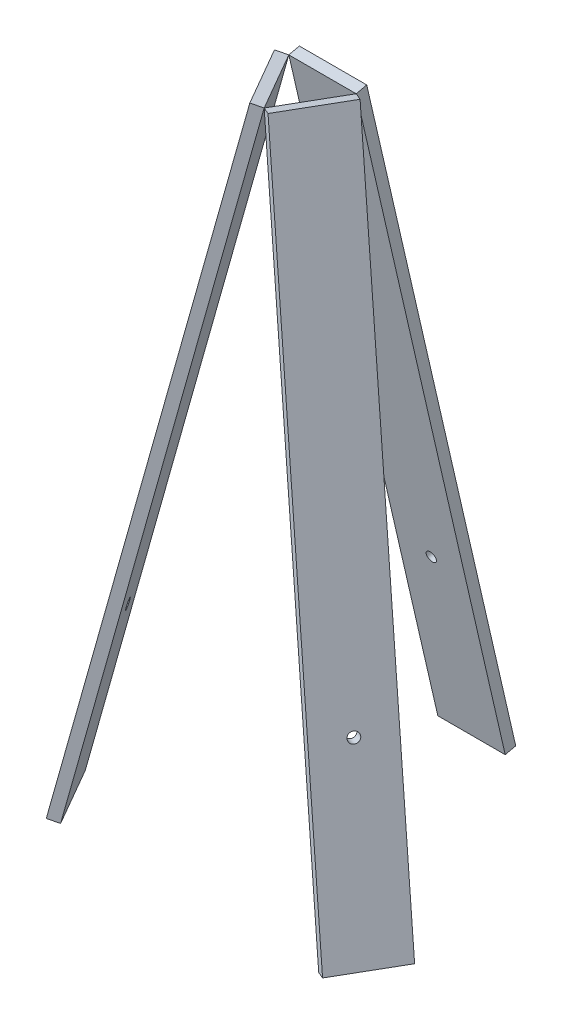
ISO-10303-21;
HEADER;
FILE_DESCRIPTION(('STEP AP214'),'2;1');
FILE_NAME('part.step','',(''),(''),'','','');
FILE_SCHEMA(('AUTOMOTIVE_DESIGN { 1 0 10303 214 1 1 1 1 }'));
ENDSEC;
DATA;
#1=APPLICATION_CONTEXT('core data for automotive mechanical design processes');
#2=APPLICATION_PROTOCOL_DEFINITION('international standard','automotive_design',2000,#1);
#3=PRODUCT_CONTEXT('',#1,'mechanical');
#4=PRODUCT('Part','Part','',(#3));
#5=PRODUCT_RELATED_PRODUCT_CATEGORY('part','',(#4));
#6=PRODUCT_DEFINITION_FORMATION('','',#4);
#7=PRODUCT_DEFINITION_CONTEXT('part definition',#1,'design');
#8=PRODUCT_DEFINITION('design','',#6,#7);
#9=PRODUCT_DEFINITION_SHAPE('','',#8);
#10=(LENGTH_UNIT() NAMED_UNIT(*) SI_UNIT(.MILLI.,.METRE.));
#11=(NAMED_UNIT(*) PLANE_ANGLE_UNIT() SI_UNIT($,.RADIAN.));
#12=(NAMED_UNIT(*) SI_UNIT($,.STERADIAN.) SOLID_ANGLE_UNIT());
#13=UNCERTAINTY_MEASURE_WITH_UNIT(LENGTH_MEASURE(1.E-05),#10,'distance_accuracy_value','');
#14=(GEOMETRIC_REPRESENTATION_CONTEXT(3) GLOBAL_UNCERTAINTY_ASSIGNED_CONTEXT((#13)) GLOBAL_UNIT_ASSIGNED_CONTEXT((#10,
#11,#12)) REPRESENTATION_CONTEXT('',''));
#15=CARTESIAN_POINT('',(0.,0.,0.));
#16=DIRECTION('',(0.,0.,1.));
#17=DIRECTION('',(1.,0.,0.));
#18=AXIS2_PLACEMENT_3D('',#15,#16,#17);
#19=CARTESIAN_POINT('',(-25.50091614306,10.3591491615835,8.94945810788122));
#20=DIRECTION('',(-0.499999999999992,0.,-0.866025403784443));
#21=DIRECTION('',(-0.866025403784443,0.,0.499999999999992));
#22=AXIS2_PLACEMENT_3D('',#19,#20,#21);
#23=PLANE('',#22);
#24=DIRECTION('',(0.194395186049515,0.974481408504561,-0.112234112994853));
#25=VECTOR('',#24,1.);
#26=CARTESIAN_POINT('',(-24.150635094611,10.,8.16987298107758));
#27=LINE('',#26,#25);
#28=CARTESIAN_POINT('',(-24.150635094611,10.,8.16987298107758));
#29=VERTEX_POINT('',#28);
#30=CARTESIAN_POINT('',(-4.99999999999997,106.,-2.88675134594818));
#31=VERTEX_POINT('',#30);
#32=EDGE_CURVE('E115',#29,#31,#27,.T.);
#33=ORIENTED_EDGE('',*,*,#32,.F.);
#34=DIRECTION('',(0.843925655280595,-0.224468225989709,-0.487240704252273));
#35=VECTOR('',#34,1.);
#36=CARTESIAN_POINT('',(-25.50091614306,10.3591491615835,8.94945810788122));
#37=LINE('',#36,#35);
#38=CARTESIAN_POINT('',(-25.50091614306,10.3591491615835,8.94945810788122));
#39=VERTEX_POINT('',#38);
#40=EDGE_CURVE('E12',#39,#29,#37,.T.);
#41=ORIENTED_EDGE('',*,*,#40,.F.);
#42=DIRECTION('',(0.194395186049515,0.974481408504561,-0.112234112994853));
#43=VECTOR('',#42,1.);
#44=CARTESIAN_POINT('',(-25.50091614306,10.3591491615835,8.94945810788122));
#45=LINE('',#44,#43);
#46=CARTESIAN_POINT('',(-6.35028104844892,106.359149161584,-2.10716621914454));
#47=VERTEX_POINT('',#46);
#48=EDGE_CURVE('E108',#39,#47,#45,.T.);
#49=ORIENTED_EDGE('',*,*,#48,.T.);
#50=DIRECTION('',(0.843925655280595,-0.224468225989709,-0.487240704252273));
#51=VECTOR('',#50,1.);
#52=CARTESIAN_POINT('',(-6.35028104844892,106.359149161584,-2.10716621914454));
#53=LINE('',#52,#51);
#54=EDGE_CURVE('E53',#47,#31,#53,.T.);
#55=ORIENTED_EDGE('',*,*,#54,.T.);
#56=EDGE_LOOP('',(#33,#41,#49,#55));
#57=FACE_BOUND('',#56,.T.);
#58=ADVANCED_FACE('F50',(#57),#23,.T.);
#59=CARTESIAN_POINT('',(-20.5009161430601,10.3591491615835,17.6097121457257));
#60=DIRECTION('',(-0.194395186049515,-0.974481408504561,0.112234112994853));
#61=DIRECTION('',(-0.843925655280595,0.224468225989709,0.487240704252273));
#62=AXIS2_PLACEMENT_3D('',#59,#60,#61);
#63=PLANE('',#62);
#64=DIRECTION('',(-0.499999999999992,0.,-0.866025403784443));
#65=VECTOR('',#64,1.);
#66=CARTESIAN_POINT('',(-19.1506350946111,10.,16.830127018922));
#67=LINE('',#66,#65);
#68=CARTESIAN_POINT('',(-19.1506350946111,10.,16.830127018922));
#69=VERTEX_POINT('',#68);
#70=EDGE_CURVE('E110',#69,#29,#67,.T.);
#71=ORIENTED_EDGE('',*,*,#70,.F.);
#72=DIRECTION('',(0.843925655280595,-0.224468225989709,-0.487240704252273));
#73=VECTOR('',#72,1.);
#74=CARTESIAN_POINT('',(-20.5009161430601,10.3591491615835,17.6097121457257));
#75=LINE('',#74,#73);
#76=CARTESIAN_POINT('',(-20.5009161430601,10.3591491615835,17.6097121457257));
#77=VERTEX_POINT('',#76);
#78=EDGE_CURVE('E59',#77,#69,#75,.T.);
#79=ORIENTED_EDGE('',*,*,#78,.F.);
#80=DIRECTION('',(-0.499999999999992,0.,-0.866025403784443));
#81=VECTOR('',#80,1.);
#82=CARTESIAN_POINT('',(-20.5009161430601,10.3591491615835,17.6097121457257));
#83=LINE('',#82,#81);
#84=EDGE_CURVE('E105',#77,#39,#83,.T.);
#85=ORIENTED_EDGE('',*,*,#84,.T.);
#86=ORIENTED_EDGE('',*,*,#40,.T.);
#87=EDGE_LOOP('',(#71,#79,#85,#86));
#88=FACE_BOUND('',#87,.T.);
#89=ADVANCED_FACE('F126',(#88),#63,.T.);
#90=CARTESIAN_POINT('',(-1.350281048449,106.359149161584,6.55308781869989));
#91=DIRECTION('',(0.499999999999992,0.,0.866025403784443));
#92=DIRECTION('',(0.866025403784443,0.,-0.499999999999992));
#93=AXIS2_PLACEMENT_3D('',#90,#91,#92);
#94=PLANE('',#93);
#95=DIRECTION('',(-0.194395186049515,-0.974481408504561,0.112234112994853));
#96=VECTOR('',#95,1.);
#97=CARTESIAN_POINT('',(0.,106.,5.77350269189626));
#98=LINE('',#97,#96);
#99=CARTESIAN_POINT('',(0.,106.,5.77350269189626));
#100=VERTEX_POINT('',#99);
#101=EDGE_CURVE('E100',#100,#69,#98,.T.);
#102=ORIENTED_EDGE('',*,*,#101,.F.);
#103=DIRECTION('',(0.843925655280595,-0.224468225989709,-0.487240704252273));
#104=VECTOR('',#103,1.);
#105=CARTESIAN_POINT('',(-1.350281048449,106.359149161584,6.55308781869989));
#106=LINE('',#105,#104);
#107=CARTESIAN_POINT('',(-1.350281048449,106.359149161584,6.55308781869989));
#108=VERTEX_POINT('',#107);
#109=EDGE_CURVE('E95',#108,#100,#106,.T.);
#110=ORIENTED_EDGE('',*,*,#109,.F.);
#111=DIRECTION('',(-0.194395186049515,-0.974481408504561,0.112234112994853));
#112=VECTOR('',#111,1.);
#113=CARTESIAN_POINT('',(-1.350281048449,106.359149161584,6.55308781869989));
#114=LINE('',#113,#112);
#115=EDGE_CURVE('E98',#108,#77,#114,.T.);
#116=ORIENTED_EDGE('',*,*,#115,.T.);
#117=ORIENTED_EDGE('',*,*,#78,.T.);
#118=EDGE_LOOP('',(#102,#110,#116,#117));
#119=FACE_BOUND('',#118,.T.);
#120=ADVANCED_FACE('F97',(#119),#94,.T.);
#121=CARTESIAN_POINT('',(-6.35028104844892,106.359149161584,-2.10716621914454));
#122=DIRECTION('',(0.194395186049515,0.974481408504561,-0.112234112994853));
#123=DIRECTION('',(0.843925655280595,-0.224468225989709,-0.487240704252273));
#124=AXIS2_PLACEMENT_3D('',#121,#122,#123);
#125=PLANE('',#124);
#126=DIRECTION('',(0.499999999999992,0.,0.866025403784443));
#127=VECTOR('',#126,1.);
#128=CARTESIAN_POINT('',(-4.99999999999997,106.,-2.88675134594818));
#129=LINE('',#128,#127);
#130=EDGE_CURVE('E118',#31,#100,#129,.T.);
#131=ORIENTED_EDGE('',*,*,#130,.F.);
#132=ORIENTED_EDGE('',*,*,#54,.F.);
#133=DIRECTION('',(0.499999999999992,0.,0.866025403784443));
#134=VECTOR('',#133,1.);
#135=CARTESIAN_POINT('',(-6.35028104844892,106.359149161584,-2.10716621914454));
#136=LINE('',#135,#134);
#137=EDGE_CURVE('E104',#47,#108,#136,.T.);
#138=ORIENTED_EDGE('',*,*,#137,.T.);
#139=ORIENTED_EDGE('',*,*,#109,.T.);
#140=EDGE_LOOP('',(#131,#132,#138,#139));
#141=FACE_BOUND('',#140,.T.);
#142=ADVANCED_FACE('F107',(#141),#125,.T.);
#143=CARTESIAN_POINT('',(-23.8043725263036,6.3315118320475,13.7434608859512));
#144=DIRECTION('',(0.843925655280595,-0.224468225989709,-0.487240704252273));
#145=DIRECTION('',(-0.194395186049515,-0.974481408504561,0.112234112994853));
#146=AXIS2_PLACEMENT_3D('',#143,#144,#145);
#147=PLANE('',#146);
#148=CARTESIAN_POINT('',(-17.8321724115731,36.2694855954062,10.2954095420573));
#149=DIRECTION('',(0.843925655280595,-0.224468225989709,-0.487240704252273));
#150=DIRECTION('',(-0.194395186049515,-0.974481408504561,0.112234112994853));
#151=AXIS2_PLACEMENT_3D('',#148,#149,#150);
#152=CIRCLE('',#151,0.750000000000009);
#153=CARTESIAN_POINT('',(-17.9779688011103,35.5386245390278,10.3795851268035));
#154=VERTEX_POINT('',#153);
#155=EDGE_CURVE('E119',#154,#154,#152,.T.);
#156=ORIENTED_EDGE('',*,*,#155,.T.);
#157=EDGE_LOOP('',(#156));
#158=FACE_BOUND('',#157,.T.);
#159=ORIENTED_EDGE('',*,*,#48,.F.);
#160=ORIENTED_EDGE('',*,*,#84,.F.);
#161=ORIENTED_EDGE('',*,*,#115,.F.);
#162=ORIENTED_EDGE('',*,*,#137,.F.);
#163=EDGE_LOOP('',(#159,#160,#161,#162));
#164=FACE_BOUND('',#163,.T.);
#165=ADVANCED_FACE('F103',(#158,#164),#147,.F.);
#166=CARTESIAN_POINT('',(-22.4540914778546,5.97236267046396,12.9638757591476));
#167=DIRECTION('',(0.843925655280595,-0.224468225989709,-0.487240704252273));
#168=DIRECTION('',(-0.194395186049515,-0.974481408504561,0.112234112994853));
#169=AXIS2_PLACEMENT_3D('',#166,#167,#168);
#170=PLANE('',#169);
#171=CARTESIAN_POINT('',(-16.4818913631242,35.9103364338226,9.51582441525371));
#172=DIRECTION('',(0.843925655280595,-0.224468225989709,-0.487240704252273));
#173=DIRECTION('',(-0.194395186049515,-0.974481408504561,0.112234112994853));
#174=AXIS2_PLACEMENT_3D('',#171,#172,#173);
#175=CIRCLE('',#174,0.750000000000009);
#176=CARTESIAN_POINT('',(-16.6276877526613,35.1794753774442,9.59999999999985));
#177=VERTEX_POINT('',#176);
#178=EDGE_CURVE('E155',#177,#177,#175,.T.);
#179=ORIENTED_EDGE('',*,*,#178,.F.);
#180=EDGE_LOOP('',(#179));
#181=FACE_BOUND('',#180,.T.);
#182=ORIENTED_EDGE('',*,*,#32,.T.);
#183=ORIENTED_EDGE('',*,*,#130,.T.);
#184=ORIENTED_EDGE('',*,*,#101,.T.);
#185=ORIENTED_EDGE('',*,*,#70,.T.);
#186=EDGE_LOOP('',(#182,#183,#184,#185));
#187=FACE_BOUND('',#186,.T.);
#188=ADVANCED_FACE('F125',(#181,#187),#170,.T.);
#189=CARTESIAN_POINT('',(-36.0178839035448,41.106540105387,20.7949349673518));
#190=DIRECTION('',(0.843925655280595,-0.224468225989709,-0.487240704252273));
#191=DIRECTION('',(-0.194395186049515,-0.974481408504561,0.112234112994853));
#192=AXIS2_PLACEMENT_3D('',#189,#190,#191);
#193=CYLINDRICAL_SURFACE('',#192,0.750000000000009);
#194=ORIENTED_EDGE('',*,*,#178,.T.);
#195=EDGE_LOOP('',(#194));
#196=FACE_BOUND('',#195,.T.);
#197=ORIENTED_EDGE('',*,*,#155,.F.);
#198=EDGE_LOOP('',(#197));
#199=FACE_BOUND('',#198,.T.);
#200=ADVANCED_FACE('F144',(#196,#199),#193,.F.);
#201=CLOSED_SHELL('',(#58,#89,#120,#142,#165,#188,#200));
#202=MANIFOLD_SOLID_BREP('B2',#201);
#203=CARTESIAN_POINT('',(20.5009161430598,10.3591491615835,17.6097121457259));
#204=DIRECTION('',(-0.500000000000004,0.,0.866025403784436));
#205=DIRECTION('',(0.866025403784436,0.,0.500000000000004));
#206=AXIS2_PLACEMENT_3D('',#203,#204,#205);
#207=PLANE('',#206);
#208=DIRECTION('',(-0.194395186049514,0.974481408504561,-0.112234112994855));
#209=VECTOR('',#208,1.);
#210=CARTESIAN_POINT('',(19.1506350946109,10.,16.8301270189223));
#211=LINE('',#210,#209);
#212=CARTESIAN_POINT('',(19.1506350946109,10.,16.8301270189223));
#213=VERTEX_POINT('',#212);
#214=CARTESIAN_POINT('',(0.,106.,5.77350269189626));
#215=VERTEX_POINT('',#214);
#216=EDGE_CURVE('E283',#213,#215,#211,.T.);
#217=ORIENTED_EDGE('',*,*,#216,.F.);
#218=DIRECTION('',(-0.843925655280589,-0.224468225989709,-0.487240704252284));
#219=VECTOR('',#218,1.);
#220=CARTESIAN_POINT('',(20.5009161430598,10.3591491615835,17.6097121457259));
#221=LINE('',#220,#219);
#222=CARTESIAN_POINT('',(20.5009161430598,10.3591491615835,17.6097121457259));
#223=VERTEX_POINT('',#222);
#224=EDGE_CURVE('E48',#223,#213,#221,.T.);
#225=ORIENTED_EDGE('',*,*,#224,.F.);
#226=DIRECTION('',(-0.194395186049514,0.974481408504561,-0.112234112994855));
#227=VECTOR('',#226,1.);
#228=CARTESIAN_POINT('',(20.5009161430598,10.3591491615835,17.6097121457259));
#229=LINE('',#228,#227);
#230=CARTESIAN_POINT('',(1.35028104844891,106.359149161584,6.55308781869991));
#231=VERTEX_POINT('',#230);
#232=EDGE_CURVE('E276',#223,#231,#229,.T.);
#233=ORIENTED_EDGE('',*,*,#232,.T.);
#234=DIRECTION('',(-0.843925655280589,-0.224468225989709,-0.487240704252284));
#235=VECTOR('',#234,1.);
#236=CARTESIAN_POINT('',(1.35028104844891,106.359149161584,6.55308781869991));
#237=LINE('',#236,#235);
#238=EDGE_CURVE('E221',#231,#215,#237,.T.);
#239=ORIENTED_EDGE('',*,*,#238,.T.);
#240=EDGE_LOOP('',(#217,#225,#233,#239));
#241=FACE_BOUND('',#240,.T.);
#242=ADVANCED_FACE('F218',(#241),#207,.T.);
#243=CARTESIAN_POINT('',(25.5009161430599,10.3591491615835,8.94945810788158));
#244=DIRECTION('',(0.194395186049514,-0.974481408504561,0.112234112994855));
#245=DIRECTION('',(0.843925655280589,0.224468225989709,0.487240704252285));
#246=AXIS2_PLACEMENT_3D('',#243,#244,#245);
#247=PLANE('',#246);
#248=DIRECTION('',(-0.500000000000004,0.,0.866025403784436));
#249=VECTOR('',#248,1.);
#250=CARTESIAN_POINT('',(24.1506350946109,10.,8.16987298107792));
#251=LINE('',#250,#249);
#252=CARTESIAN_POINT('',(24.1506350946109,10.,8.16987298107792));
#253=VERTEX_POINT('',#252);
#254=EDGE_CURVE('E278',#253,#213,#251,.T.);
#255=ORIENTED_EDGE('',*,*,#254,.F.);
#256=DIRECTION('',(-0.843925655280589,-0.224468225989709,-0.487240704252284));
#257=VECTOR('',#256,1.);
#258=CARTESIAN_POINT('',(25.5009161430599,10.3591491615835,8.94945810788158));
#259=LINE('',#258,#257);
#260=CARTESIAN_POINT('',(25.5009161430599,10.3591491615835,8.94945810788158));
#261=VERTEX_POINT('',#260);
#262=EDGE_CURVE('E227',#261,#253,#259,.T.);
#263=ORIENTED_EDGE('',*,*,#262,.F.);
#264=DIRECTION('',(-0.500000000000004,0.,0.866025403784436));
#265=VECTOR('',#264,1.);
#266=CARTESIAN_POINT('',(25.5009161430599,10.3591491615835,8.94945810788158));
#267=LINE('',#266,#265);
#268=EDGE_CURVE('E273',#261,#223,#267,.T.);
#269=ORIENTED_EDGE('',*,*,#268,.T.);
#270=ORIENTED_EDGE('',*,*,#224,.T.);
#271=EDGE_LOOP('',(#255,#263,#269,#270));
#272=FACE_BOUND('',#271,.T.);
#273=ADVANCED_FACE('F294',(#272),#247,.T.);
#274=CARTESIAN_POINT('',(6.35028104844895,106.359149161584,-2.10716621914445));
#275=DIRECTION('',(0.500000000000004,0.,-0.866025403784436));
#276=DIRECTION('',(-0.866025403784436,0.,-0.500000000000004));
#277=AXIS2_PLACEMENT_3D('',#274,#275,#276);
#278=PLANE('',#277);
#279=DIRECTION('',(0.194395186049514,-0.974481408504561,0.112234112994855));
#280=VECTOR('',#279,1.);
#281=CARTESIAN_POINT('',(5.00000000000001,106.,-2.88675134594811));
#282=LINE('',#281,#280);
#283=CARTESIAN_POINT('',(5.00000000000001,106.,-2.88675134594811));
#284=VERTEX_POINT('',#283);
#285=EDGE_CURVE('E268',#284,#253,#282,.T.);
#286=ORIENTED_EDGE('',*,*,#285,.F.);
#287=DIRECTION('',(-0.843925655280589,-0.224468225989709,-0.487240704252284));
#288=VECTOR('',#287,1.);
#289=CARTESIAN_POINT('',(6.35028104844895,106.359149161584,-2.10716621914445));
#290=LINE('',#289,#288);
#291=CARTESIAN_POINT('',(6.35028104844895,106.359149161584,-2.10716621914445));
#292=VERTEX_POINT('',#291);
#293=EDGE_CURVE('E263',#292,#284,#290,.T.);
#294=ORIENTED_EDGE('',*,*,#293,.F.);
#295=DIRECTION('',(0.194395186049514,-0.974481408504561,0.112234112994855));
#296=VECTOR('',#295,1.);
#297=CARTESIAN_POINT('',(6.35028104844895,106.359149161584,-2.10716621914445));
#298=LINE('',#297,#296);
#299=EDGE_CURVE('E266',#292,#261,#298,.T.);
#300=ORIENTED_EDGE('',*,*,#299,.T.);
#301=ORIENTED_EDGE('',*,*,#262,.T.);
#302=EDGE_LOOP('',(#286,#294,#300,#301));
#303=FACE_BOUND('',#302,.T.);
#304=ADVANCED_FACE('F265',(#303),#278,.T.);
#305=CARTESIAN_POINT('',(1.35028104844891,106.359149161584,6.55308781869991));
#306=DIRECTION('',(-0.194395186049514,0.974481408504561,-0.112234112994855));
#307=DIRECTION('',(-0.843925655280589,-0.224468225989709,-0.487240704252285));
#308=AXIS2_PLACEMENT_3D('',#305,#306,#307);
#309=PLANE('',#308);
#310=DIRECTION('',(0.500000000000004,0.,-0.866025403784436));
#311=VECTOR('',#310,1.);
#312=CARTESIAN_POINT('',(0.,106.,5.77350269189626));
#313=LINE('',#312,#311);
#314=EDGE_CURVE('E286',#215,#284,#313,.T.);
#315=ORIENTED_EDGE('',*,*,#314,.F.);
#316=ORIENTED_EDGE('',*,*,#238,.F.);
#317=DIRECTION('',(0.500000000000004,0.,-0.866025403784436));
#318=VECTOR('',#317,1.);
#319=CARTESIAN_POINT('',(1.35028104844891,106.359149161584,6.55308781869991));
#320=LINE('',#319,#318);
#321=EDGE_CURVE('E272',#231,#292,#320,.T.);
#322=ORIENTED_EDGE('',*,*,#321,.T.);
#323=ORIENTED_EDGE('',*,*,#293,.T.);
#324=EDGE_LOOP('',(#315,#316,#322,#323));
#325=FACE_BOUND('',#324,.T.);
#326=ADVANCED_FACE('F275',(#325),#309,.T.);
#327=CARTESIAN_POINT('',(23.8043725263034,6.3315118320475,13.7434608859515));
#328=DIRECTION('',(-0.843925655280589,-0.224468225989709,-0.487240704252284));
#329=DIRECTION('',(0.194395186049514,-0.974481408504561,0.112234112994855));
#330=AXIS2_PLACEMENT_3D('',#327,#328,#329);
#331=PLANE('',#330);
#332=CARTESIAN_POINT('',(17.832172411573,36.2694855954062,10.2954095420576));
#333=DIRECTION('',(-0.843925655280589,-0.224468225989709,-0.487240704252284));
#334=DIRECTION('',(0.194395186049514,-0.974481408504561,0.112234112994855));
#335=AXIS2_PLACEMENT_3D('',#332,#333,#334);
#336=CIRCLE('',#335,0.750000000000009);
#337=CARTESIAN_POINT('',(17.9779688011101,35.5386245390278,10.3795851268037));
#338=VERTEX_POINT('',#337);
#339=EDGE_CURVE('E287',#338,#338,#336,.T.);
#340=ORIENTED_EDGE('',*,*,#339,.T.);
#341=EDGE_LOOP('',(#340));
#342=FACE_BOUND('',#341,.T.);
#343=ORIENTED_EDGE('',*,*,#232,.F.);
#344=ORIENTED_EDGE('',*,*,#268,.F.);
#345=ORIENTED_EDGE('',*,*,#299,.F.);
#346=ORIENTED_EDGE('',*,*,#321,.F.);
#347=EDGE_LOOP('',(#343,#344,#345,#346));
#348=FACE_BOUND('',#347,.T.);
#349=ADVANCED_FACE('F271',(#342,#348),#331,.F.);
#350=CARTESIAN_POINT('',(22.4540914778544,5.97236267046396,12.9638757591479));
#351=DIRECTION('',(-0.843925655280589,-0.224468225989709,-0.487240704252284));
#352=DIRECTION('',(0.194395186049514,-0.974481408504561,0.112234112994855));
#353=AXIS2_PLACEMENT_3D('',#350,#351,#352);
#354=PLANE('',#353);
#355=CARTESIAN_POINT('',(16.481891363124,35.9103364338226,9.51582441525394));
#356=DIRECTION('',(-0.843925655280589,-0.224468225989709,-0.487240704252284));
#357=DIRECTION('',(0.194395186049514,-0.974481408504561,0.112234112994855));
#358=AXIS2_PLACEMENT_3D('',#355,#356,#357);
#359=CIRCLE('',#358,0.750000000000009);
#360=CARTESIAN_POINT('',(16.6276877526612,35.1794753774442,9.60000000000008));
#361=VERTEX_POINT('',#360);
#362=EDGE_CURVE('E323',#361,#361,#359,.T.);
#363=ORIENTED_EDGE('',*,*,#362,.F.);
#364=EDGE_LOOP('',(#363));
#365=FACE_BOUND('',#364,.T.);
#366=ORIENTED_EDGE('',*,*,#216,.T.);
#367=ORIENTED_EDGE('',*,*,#314,.T.);
#368=ORIENTED_EDGE('',*,*,#285,.T.);
#369=ORIENTED_EDGE('',*,*,#254,.T.);
#370=EDGE_LOOP('',(#366,#367,#368,#369));
#371=FACE_BOUND('',#370,.T.);
#372=ADVANCED_FACE('F293',(#365,#371),#354,.T.);
#373=CARTESIAN_POINT('',(36.0178839035445,41.106540105387,20.7949349673523));
#374=DIRECTION('',(-0.843925655280589,-0.224468225989709,-0.487240704252284));
#375=DIRECTION('',(0.194395186049514,-0.974481408504561,0.112234112994855));
#376=AXIS2_PLACEMENT_3D('',#373,#374,#375);
#377=CYLINDRICAL_SURFACE('',#376,0.750000000000009);
#378=ORIENTED_EDGE('',*,*,#362,.T.);
#379=EDGE_LOOP('',(#378));
#380=FACE_BOUND('',#379,.T.);
#381=ORIENTED_EDGE('',*,*,#339,.F.);
#382=EDGE_LOOP('',(#381));
#383=FACE_BOUND('',#382,.T.);
#384=ADVANCED_FACE('F312',(#380,#383),#377,.F.);
#385=CLOSED_SHELL('',(#242,#273,#304,#326,#349,#372,#384));
#386=MANIFOLD_SOLID_BREP('B6',#385);
#387=CARTESIAN_POINT('',(5.,10.3591491615835,-26.5591702536073));
#388=DIRECTION('',(1.,0.,0.));
#389=DIRECTION('',(0.,0.,-1.));
#390=AXIS2_PLACEMENT_3D('',#387,#388,#389);
#391=PLANE('',#390);
#392=DIRECTION('',(0.,0.974481408504561,0.224468225989709));
#393=VECTOR('',#392,1.);
#394=CARTESIAN_POINT('',(5.,10.,-25.));
#395=LINE('',#394,#393);
#396=CARTESIAN_POINT('',(5.,10.,-25.));
#397=VERTEX_POINT('',#396);
#398=CARTESIAN_POINT('',(5.,106.,-2.88675134594813));
#399=VERTEX_POINT('',#398);
#400=EDGE_CURVE('E442',#397,#399,#395,.T.);
#401=ORIENTED_EDGE('',*,*,#400,.F.);
#402=DIRECTION('',(0.,-0.224468225989709,0.974481408504561));
#403=VECTOR('',#402,1.);
#404=CARTESIAN_POINT('',(5.,10.3591491615835,-26.5591702536073));
#405=LINE('',#404,#403);
#406=CARTESIAN_POINT('',(5.,10.3591491615835,-26.5591702536073));
#407=VERTEX_POINT('',#406);
#408=EDGE_CURVE('E216',#407,#397,#405,.T.);
#409=ORIENTED_EDGE('',*,*,#408,.F.);
#410=DIRECTION('',(0.,0.974481408504561,0.224468225989709));
#411=VECTOR('',#410,1.);
#412=CARTESIAN_POINT('',(5.,10.3591491615835,-26.5591702536073));
#413=LINE('',#412,#411);
#414=CARTESIAN_POINT('',(5.,106.359149161584,-4.44592159955542));
#415=VERTEX_POINT('',#414);
#416=EDGE_CURVE('E435',#407,#415,#413,.T.);
#417=ORIENTED_EDGE('',*,*,#416,.T.);
#418=DIRECTION('',(0.,-0.224468225989709,0.974481408504561));
#419=VECTOR('',#418,1.);
#420=CARTESIAN_POINT('',(5.,106.359149161584,-4.44592159955542));
#421=LINE('',#420,#419);
#422=EDGE_CURVE('E380',#415,#399,#421,.T.);
#423=ORIENTED_EDGE('',*,*,#422,.T.);
#424=EDGE_LOOP('',(#401,#409,#417,#423));
#425=FACE_BOUND('',#424,.T.);
#426=ADVANCED_FACE('F377',(#425),#391,.T.);
#427=CARTESIAN_POINT('',(-5.,10.3591491615835,-26.5591702536073));
#428=DIRECTION('',(0.,-0.974481408504561,-0.224468225989709));
#429=DIRECTION('',(0.,0.224468225989709,-0.974481408504561));
#430=AXIS2_PLACEMENT_3D('',#427,#428,#429);
#431=PLANE('',#430);
#432=DIRECTION('',(1.,0.,0.));
#433=VECTOR('',#432,1.);
#434=CARTESIAN_POINT('',(-5.,10.,-25.));
#435=LINE('',#434,#433);
#436=CARTESIAN_POINT('',(-5.,10.,-25.));
#437=VERTEX_POINT('',#436);
#438=EDGE_CURVE('E437',#437,#397,#435,.T.);
#439=ORIENTED_EDGE('',*,*,#438,.F.);
#440=DIRECTION('',(0.,-0.224468225989709,0.974481408504561));
#441=VECTOR('',#440,1.);
#442=CARTESIAN_POINT('',(-5.,10.3591491615835,-26.5591702536073));
#443=LINE('',#442,#441);
#444=CARTESIAN_POINT('',(-5.,10.3591491615835,-26.5591702536073));
#445=VERTEX_POINT('',#444);
#446=EDGE_CURVE('E386',#445,#437,#443,.T.);
#447=ORIENTED_EDGE('',*,*,#446,.F.);
#448=DIRECTION('',(1.,0.,0.));
#449=VECTOR('',#448,1.);
#450=CARTESIAN_POINT('',(-5.,10.3591491615835,-26.5591702536073));
#451=LINE('',#450,#449);
#452=EDGE_CURVE('E432',#445,#407,#451,.T.);
#453=ORIENTED_EDGE('',*,*,#452,.T.);
#454=ORIENTED_EDGE('',*,*,#408,.T.);
#455=EDGE_LOOP('',(#439,#447,#453,#454));
#456=FACE_BOUND('',#455,.T.);
#457=ADVANCED_FACE('F453',(#456),#431,.T.);
#458=CARTESIAN_POINT('',(-5.,106.359149161584,-4.44592159955542));
#459=DIRECTION('',(-1.,0.,0.));
#460=DIRECTION('',(0.,0.,1.));
#461=AXIS2_PLACEMENT_3D('',#458,#459,#460);
#462=PLANE('',#461);
#463=DIRECTION('',(0.,-0.974481408504561,-0.224468225989709));
#464=VECTOR('',#463,1.);
#465=CARTESIAN_POINT('',(-5.,106.,-2.88675134594813));
#466=LINE('',#465,#464);
#467=CARTESIAN_POINT('',(-5.,106.,-2.88675134594813));
#468=VERTEX_POINT('',#467);
#469=EDGE_CURVE('E427',#468,#437,#466,.T.);
#470=ORIENTED_EDGE('',*,*,#469,.F.);
#471=DIRECTION('',(0.,-0.224468225989709,0.974481408504561));
#472=VECTOR('',#471,1.);
#473=CARTESIAN_POINT('',(-5.,106.359149161584,-4.44592159955542));
#474=LINE('',#473,#472);
#475=CARTESIAN_POINT('',(-5.,106.359149161584,-4.44592159955542));
#476=VERTEX_POINT('',#475);
#477=EDGE_CURVE('E422',#476,#468,#474,.T.);
#478=ORIENTED_EDGE('',*,*,#477,.F.);
#479=DIRECTION('',(0.,-0.974481408504561,-0.224468225989709));
#480=VECTOR('',#479,1.);
#481=CARTESIAN_POINT('',(-5.,106.359149161584,-4.44592159955542));
#482=LINE('',#481,#480);
#483=EDGE_CURVE('E425',#476,#445,#482,.T.);
#484=ORIENTED_EDGE('',*,*,#483,.T.);
#485=ORIENTED_EDGE('',*,*,#446,.T.);
#486=EDGE_LOOP('',(#470,#478,#484,#485));
#487=FACE_BOUND('',#486,.T.);
#488=ADVANCED_FACE('F424',(#487),#462,.T.);
#489=CARTESIAN_POINT('',(5.,106.359149161584,-4.44592159955542));
#490=DIRECTION('',(0.,0.974481408504561,0.224468225989709));
#491=DIRECTION('',(0.,-0.224468225989709,0.974481408504561));
#492=AXIS2_PLACEMENT_3D('',#489,#490,#491);
#493=PLANE('',#492);
#494=DIRECTION('',(-1.,0.,0.));
#495=VECTOR('',#494,1.);
#496=CARTESIAN_POINT('',(5.,106.,-2.88675134594813));
#497=LINE('',#496,#495);
#498=EDGE_CURVE('E445',#399,#468,#497,.T.);
#499=ORIENTED_EDGE('',*,*,#498,.F.);
#500=ORIENTED_EDGE('',*,*,#422,.F.);
#501=DIRECTION('',(-1.,0.,0.));
#502=VECTOR('',#501,1.);
#503=CARTESIAN_POINT('',(5.,106.359149161584,-4.44592159955542));
#504=LINE('',#503,#502);
#505=EDGE_CURVE('E431',#415,#476,#504,.T.);
#506=ORIENTED_EDGE('',*,*,#505,.T.);
#507=ORIENTED_EDGE('',*,*,#477,.T.);
#508=EDGE_LOOP('',(#499,#500,#506,#507));
#509=FACE_BOUND('',#508,.T.);
#510=ADVANCED_FACE('F434',(#509),#493,.T.);
#511=CARTESIAN_POINT('',(0.,6.3315118320475,-27.4869217719028));
#512=DIRECTION('',(0.,-0.224468225989709,0.974481408504561));
#513=DIRECTION('',(0.,-0.974481408504561,-0.224468225989709));
#514=AXIS2_PLACEMENT_3D('',#511,#512,#513);
#515=PLANE('',#514);
#516=CARTESIAN_POINT('',(0.,36.2694855954062,-20.590819084115));
#517=DIRECTION('',(0.,-0.224468225989709,0.974481408504561));
#518=DIRECTION('',(0.,-0.974481408504561,-0.224468225989709));
#519=AXIS2_PLACEMENT_3D('',#516,#517,#518);
#520=CIRCLE('',#519,0.750000000000009);
#521=CARTESIAN_POINT('',(0.,35.5386245390278,-20.7591702536073));
#522=VERTEX_POINT('',#521);
#523=EDGE_CURVE('E446',#522,#522,#520,.T.);
#524=ORIENTED_EDGE('',*,*,#523,.T.);
#525=EDGE_LOOP('',(#524));
#526=FACE_BOUND('',#525,.T.);
#527=ORIENTED_EDGE('',*,*,#416,.F.);
#528=ORIENTED_EDGE('',*,*,#452,.F.);
#529=ORIENTED_EDGE('',*,*,#483,.F.);
#530=ORIENTED_EDGE('',*,*,#505,.F.);
#531=EDGE_LOOP('',(#527,#528,#529,#530));
#532=FACE_BOUND('',#531,.T.);
#533=ADVANCED_FACE('F430',(#526,#532),#515,.F.);
#534=CARTESIAN_POINT('',(0.,5.97236267046396,-25.9277515182955));
#535=DIRECTION('',(0.,-0.224468225989709,0.974481408504561));
#536=DIRECTION('',(0.,-0.974481408504561,-0.224468225989709));
#537=AXIS2_PLACEMENT_3D('',#534,#535,#536);
#538=PLANE('',#537);
#539=CARTESIAN_POINT('',(0.,35.9103364338226,-19.0316488305077));
#540=DIRECTION('',(0.,-0.224468225989709,0.974481408504561));
#541=DIRECTION('',(0.,-0.974481408504561,-0.224468225989709));
#542=AXIS2_PLACEMENT_3D('',#539,#540,#541);
#543=CIRCLE('',#542,0.750000000000009);
#544=CARTESIAN_POINT('',(0.,35.1794753774442,-19.2));
#545=VERTEX_POINT('',#544);
#546=EDGE_CURVE('E482',#545,#545,#543,.T.);
#547=ORIENTED_EDGE('',*,*,#546,.F.);
#548=EDGE_LOOP('',(#547));
#549=FACE_BOUND('',#548,.T.);
#550=ORIENTED_EDGE('',*,*,#400,.T.);
#551=ORIENTED_EDGE('',*,*,#498,.T.);
#552=ORIENTED_EDGE('',*,*,#469,.T.);
#553=ORIENTED_EDGE('',*,*,#438,.T.);
#554=EDGE_LOOP('',(#550,#551,#552,#553));
#555=FACE_BOUND('',#554,.T.);
#556=ADVANCED_FACE('F452',(#549,#555),#538,.T.);
#557=CARTESIAN_POINT('',(0.,41.106540105387,-41.5898699347043));
#558=DIRECTION('',(0.,-0.224468225989709,0.974481408504561));
#559=DIRECTION('',(0.,-0.974481408504561,-0.224468225989709));
#560=AXIS2_PLACEMENT_3D('',#557,#558,#559);
#561=CYLINDRICAL_SURFACE('',#560,0.750000000000009);
#562=ORIENTED_EDGE('',*,*,#546,.T.);
#563=EDGE_LOOP('',(#562));
#564=FACE_BOUND('',#563,.T.);
#565=ORIENTED_EDGE('',*,*,#523,.F.);
#566=EDGE_LOOP('',(#565));
#567=FACE_BOUND('',#566,.T.);
#568=ADVANCED_FACE('F471',(#564,#567),#561,.F.);
#569=CLOSED_SHELL('',(#426,#457,#488,#510,#533,#556,#568));
#570=MANIFOLD_SOLID_BREP('B42',#569);
#571=ADVANCED_BREP_SHAPE_REPRESENTATION('',(#18,#202,#386,#570),#14);
#572=SHAPE_DEFINITION_REPRESENTATION(#9,#571);
ENDSEC;
END-ISO-10303-21;
